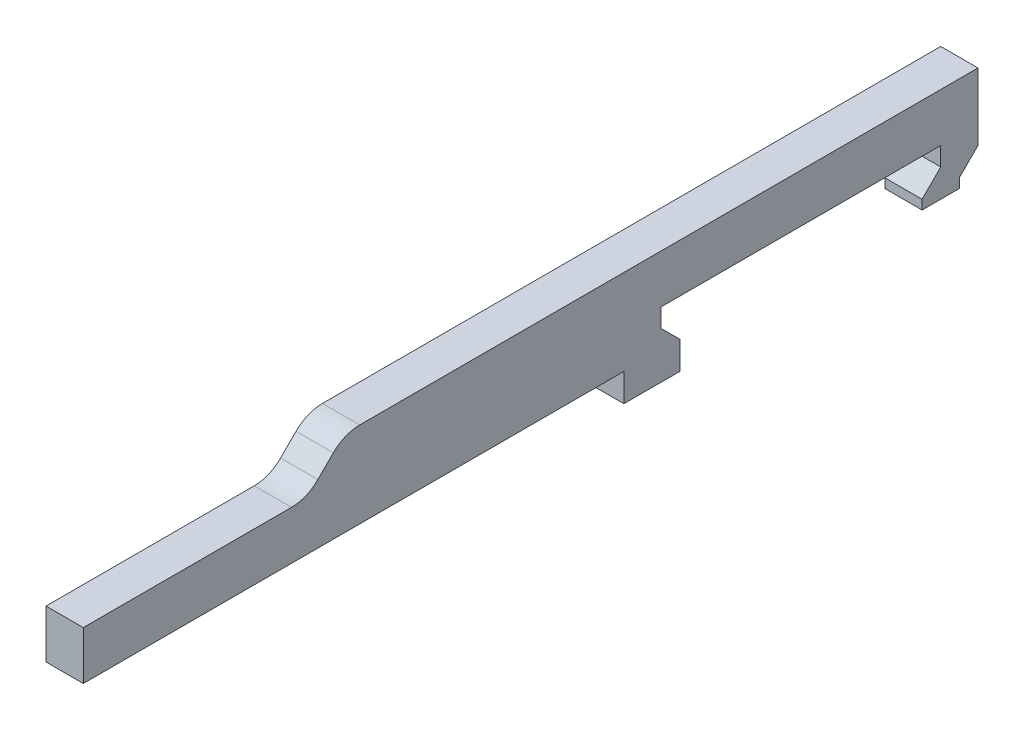
ISO-10303-21;
HEADER;
FILE_DESCRIPTION(('STEP AP214'),'2;1');
FILE_NAME('part.step','',(''),(''),'','','');
FILE_SCHEMA(('AUTOMOTIVE_DESIGN { 1 0 10303 214 1 1 1 1 }'));
ENDSEC;
DATA;
#1=APPLICATION_CONTEXT('core data for automotive mechanical design processes');
#2=APPLICATION_PROTOCOL_DEFINITION('international standard','automotive_design',2000,#1);
#3=PRODUCT_CONTEXT('',#1,'mechanical');
#4=PRODUCT('Part','Part','',(#3));
#5=PRODUCT_RELATED_PRODUCT_CATEGORY('part','',(#4));
#6=PRODUCT_DEFINITION_FORMATION('','',#4);
#7=PRODUCT_DEFINITION_CONTEXT('part definition',#1,'design');
#8=PRODUCT_DEFINITION('design','',#6,#7);
#9=PRODUCT_DEFINITION_SHAPE('','',#8);
#10=(LENGTH_UNIT() NAMED_UNIT(*) SI_UNIT(.MILLI.,.METRE.));
#11=(NAMED_UNIT(*) PLANE_ANGLE_UNIT() SI_UNIT($,.RADIAN.));
#12=(NAMED_UNIT(*) SI_UNIT($,.STERADIAN.) SOLID_ANGLE_UNIT());
#13=UNCERTAINTY_MEASURE_WITH_UNIT(LENGTH_MEASURE(1.E-05),#10,'distance_accuracy_value','');
#14=(GEOMETRIC_REPRESENTATION_CONTEXT(3) GLOBAL_UNCERTAINTY_ASSIGNED_CONTEXT((#13)) GLOBAL_UNIT_ASSIGNED_CONTEXT((#10,
#11,#12)) REPRESENTATION_CONTEXT('',''));
#15=CARTESIAN_POINT('',(0.,0.,0.));
#16=DIRECTION('',(0.,0.,1.));
#17=DIRECTION('',(1.,0.,0.));
#18=AXIS2_PLACEMENT_3D('',#15,#16,#17);
#19=CARTESIAN_POINT('',(2.,0.,-48.));
#20=DIRECTION('',(0.,0.,1.));
#21=DIRECTION('',(1.,0.,0.));
#22=AXIS2_PLACEMENT_3D('',#19,#20,#21);
#23=PLANE('',#22);
#24=DIRECTION('',(0.,1.,0.));
#25=VECTOR('',#24,1.);
#26=CARTESIAN_POINT('',(0.,0.,-48.));
#27=LINE('',#26,#25);
#28=CARTESIAN_POINT('',(0.,0.999999999999994,-48.));
#29=VERTEX_POINT('',#28);
#30=CARTESIAN_POINT('',(0.,4.6,-48.));
#31=VERTEX_POINT('',#30);
#32=EDGE_CURVE('E192',#29,#31,#27,.T.);
#33=ORIENTED_EDGE('',*,*,#32,.T.);
#34=DIRECTION('',(-1.,0.,0.));
#35=VECTOR('',#34,1.);
#36=CARTESIAN_POINT('',(2.,4.6,-48.));
#37=LINE('',#36,#35);
#38=CARTESIAN_POINT('',(2.,4.6,-48.));
#39=VERTEX_POINT('',#38);
#40=EDGE_CURVE('E176',#39,#31,#37,.T.);
#41=ORIENTED_EDGE('',*,*,#40,.F.);
#42=DIRECTION('',(0.,1.,0.));
#43=VECTOR('',#42,1.);
#44=CARTESIAN_POINT('',(2.,0.,-48.));
#45=LINE('',#44,#43);
#46=CARTESIAN_POINT('',(2.,0.999999999999994,-48.));
#47=VERTEX_POINT('',#46);
#48=EDGE_CURVE('E180',#47,#39,#45,.T.);
#49=ORIENTED_EDGE('',*,*,#48,.F.);
#50=DIRECTION('',(-1.,0.,0.));
#51=VECTOR('',#50,1.);
#52=CARTESIAN_POINT('',(2.,0.999999999999994,-48.));
#53=LINE('',#52,#51);
#54=EDGE_CURVE('E266',#47,#29,#53,.T.);
#55=ORIENTED_EDGE('',*,*,#54,.T.);
#56=EDGE_LOOP('',(#33,#41,#49,#55));
#57=FACE_BOUND('',#56,.T.);
#58=ADVANCED_FACE('F36',(#57),#23,.F.);
#59=CARTESIAN_POINT('',(2.,4.59999999999999,0.));
#60=DIRECTION('',(0.,-1.,0.));
#61=DIRECTION('',(0.,0.,-1.));
#62=AXIS2_PLACEMENT_3D('',#59,#60,#61);
#63=PLANE('',#62);
#64=DIRECTION('',(0.,0.,1.));
#65=VECTOR('',#64,1.);
#66=CARTESIAN_POINT('',(0.,4.59999999999999,0.));
#67=LINE('',#66,#65);
#68=CARTESIAN_POINT('',(0.,4.59999999999999,-14.8284271247462));
#69=VERTEX_POINT('',#68);
#70=EDGE_CURVE('E227',#31,#69,#67,.T.);
#71=ORIENTED_EDGE('',*,*,#70,.T.);
#72=DIRECTION('',(-1.,0.,0.));
#73=VECTOR('',#72,1.);
#74=CARTESIAN_POINT('',(2.,4.59999999999999,-14.8284271247462));
#75=LINE('',#74,#73);
#76=CARTESIAN_POINT('',(2.,4.59999999999999,-14.8284271247462));
#77=VERTEX_POINT('',#76);
#78=EDGE_CURVE('E57',#69,#77,#75,.F.);
#79=ORIENTED_EDGE('',*,*,#78,.T.);
#80=DIRECTION('',(0.,0.,1.));
#81=VECTOR('',#80,1.);
#82=CARTESIAN_POINT('',(2.,4.59999999999999,0.));
#83=LINE('',#82,#81);
#84=EDGE_CURVE('E172',#39,#77,#83,.T.);
#85=ORIENTED_EDGE('',*,*,#84,.F.);
#86=ORIENTED_EDGE('',*,*,#40,.T.);
#87=EDGE_LOOP('',(#71,#79,#85,#86));
#88=FACE_BOUND('',#87,.T.);
#89=ADVANCED_FACE('F174',(#88),#63,.F.);
#90=CARTESIAN_POINT('',(2.,-4.7,-4.7));
#91=DIRECTION('',(0.,0.707106781186547,0.707106781186548));
#92=DIRECTION('',(0.,-0.707106781186548,0.707106781186547));
#93=AXIS2_PLACEMENT_3D('',#90,#91,#92);
#94=PLANE('',#93);
#95=DIRECTION('',(0.,0.707106781186548,-0.707106781186547));
#96=VECTOR('',#95,1.);
#97=CARTESIAN_POINT('',(2.,-4.7,-4.7));
#98=LINE('',#97,#96);
#99=CARTESIAN_POINT('',(2.,3.1857864376269,-12.5857864376269));
#100=VERTEX_POINT('',#99);
#101=CARTESIAN_POINT('',(2.,4.01421356237309,-13.4142135623731));
#102=VERTEX_POINT('',#101);
#103=EDGE_CURVE('E179',#100,#102,#98,.T.);
#104=ORIENTED_EDGE('',*,*,#103,.T.);
#105=DIRECTION('',(-1.,0.,0.));
#106=VECTOR('',#105,1.);
#107=CARTESIAN_POINT('',(0.,4.01421356237309,-13.4142135623731));
#108=LINE('',#107,#106);
#109=CARTESIAN_POINT('',(0.,4.01421356237309,-13.4142135623731));
#110=VERTEX_POINT('',#109);
#111=EDGE_CURVE('E196',#102,#110,#108,.T.);
#112=ORIENTED_EDGE('',*,*,#111,.T.);
#113=DIRECTION('',(0.,0.707106781186548,-0.707106781186547));
#114=VECTOR('',#113,1.);
#115=CARTESIAN_POINT('',(0.,-4.7,-4.7));
#116=LINE('',#115,#114);
#117=CARTESIAN_POINT('',(0.,3.1857864376269,-12.5857864376269));
#118=VERTEX_POINT('',#117);
#119=EDGE_CURVE('E216',#118,#110,#116,.T.);
#120=ORIENTED_EDGE('',*,*,#119,.F.);
#121=DIRECTION('',(-1.,0.,0.));
#122=VECTOR('',#121,1.);
#123=CARTESIAN_POINT('',(2.,3.1857864376269,-12.5857864376269));
#124=LINE('',#123,#122);
#125=EDGE_CURVE('E193',#118,#100,#124,.F.);
#126=ORIENTED_EDGE('',*,*,#125,.T.);
#127=EDGE_LOOP('',(#104,#112,#120,#126));
#128=FACE_BOUND('',#127,.T.);
#129=ADVANCED_FACE('F225',(#128),#94,.T.);
#130=CARTESIAN_POINT('',(2.,2.6,0.));
#131=DIRECTION('',(0.,1.,0.));
#132=DIRECTION('',(0.,0.,1.));
#133=AXIS2_PLACEMENT_3D('',#130,#131,#132);
#134=PLANE('',#133);
#135=DIRECTION('',(0.,0.,-1.));
#136=VECTOR('',#135,1.);
#137=CARTESIAN_POINT('',(2.,2.6,0.));
#138=LINE('',#137,#136);
#139=CARTESIAN_POINT('',(2.,2.6,0.));
#140=VERTEX_POINT('',#139);
#141=CARTESIAN_POINT('',(2.,2.6,-11.1715728752538));
#142=VERTEX_POINT('',#141);
#143=EDGE_CURVE('E231',#140,#142,#138,.T.);
#144=ORIENTED_EDGE('',*,*,#143,.T.);
#145=DIRECTION('',(-1.,0.,0.));
#146=VECTOR('',#145,1.);
#147=CARTESIAN_POINT('',(0.,2.6,-11.1715728752538));
#148=LINE('',#147,#146);
#149=CARTESIAN_POINT('',(0.,2.6,-11.1715728752538));
#150=VERTEX_POINT('',#149);
#151=EDGE_CURVE('E209',#142,#150,#148,.T.);
#152=ORIENTED_EDGE('',*,*,#151,.T.);
#153=DIRECTION('',(0.,0.,-1.));
#154=VECTOR('',#153,1.);
#155=CARTESIAN_POINT('',(0.,2.6,0.));
#156=LINE('',#155,#154);
#157=CARTESIAN_POINT('',(0.,2.6,0.));
#158=VERTEX_POINT('',#157);
#159=EDGE_CURVE('E219',#158,#150,#156,.T.);
#160=ORIENTED_EDGE('',*,*,#159,.F.);
#161=DIRECTION('',(-1.,0.,0.));
#162=VECTOR('',#161,1.);
#163=CARTESIAN_POINT('',(2.,2.6,0.));
#164=LINE('',#163,#162);
#165=EDGE_CURVE('E194',#140,#158,#164,.T.);
#166=ORIENTED_EDGE('',*,*,#165,.F.);
#167=EDGE_LOOP('',(#144,#152,#160,#166));
#168=FACE_BOUND('',#167,.T.);
#169=ADVANCED_FACE('F230',(#168),#134,.T.);
#170=CARTESIAN_POINT('',(2.,0.,0.));
#171=DIRECTION('',(0.,0.,1.));
#172=DIRECTION('',(1.,0.,0.));
#173=AXIS2_PLACEMENT_3D('',#170,#171,#172);
#174=PLANE('',#173);
#175=DIRECTION('',(0.,1.,0.));
#176=VECTOR('',#175,1.);
#177=CARTESIAN_POINT('',(0.,0.,0.));
#178=LINE('',#177,#176);
#179=CARTESIAN_POINT('',(0.,0.,0.));
#180=VERTEX_POINT('',#179);
#181=EDGE_CURVE('E270',#180,#158,#178,.T.);
#182=ORIENTED_EDGE('',*,*,#181,.F.);
#183=DIRECTION('',(-1.,0.,0.));
#184=VECTOR('',#183,1.);
#185=CARTESIAN_POINT('',(2.,0.,0.));
#186=LINE('',#185,#184);
#187=CARTESIAN_POINT('',(2.,0.,0.));
#188=VERTEX_POINT('',#187);
#189=EDGE_CURVE('E198',#188,#180,#186,.T.);
#190=ORIENTED_EDGE('',*,*,#189,.F.);
#191=DIRECTION('',(0.,1.,0.));
#192=VECTOR('',#191,1.);
#193=CARTESIAN_POINT('',(2.,0.,0.));
#194=LINE('',#193,#192);
#195=EDGE_CURVE('E234',#188,#140,#194,.T.);
#196=ORIENTED_EDGE('',*,*,#195,.T.);
#197=ORIENTED_EDGE('',*,*,#165,.T.);
#198=EDGE_LOOP('',(#182,#190,#196,#197));
#199=FACE_BOUND('',#198,.T.);
#200=ADVANCED_FACE('F342',(#199),#174,.T.);
#201=CARTESIAN_POINT('',(2.,0.,0.));
#202=DIRECTION('',(0.,1.,0.));
#203=DIRECTION('',(0.,0.,1.));
#204=AXIS2_PLACEMENT_3D('',#201,#202,#203);
#205=PLANE('',#204);
#206=DIRECTION('',(0.,0.,-1.));
#207=VECTOR('',#206,1.);
#208=CARTESIAN_POINT('',(0.,0.,0.));
#209=LINE('',#208,#207);
#210=CARTESIAN_POINT('',(0.,0.,-29.));
#211=VERTEX_POINT('',#210);
#212=EDGE_CURVE('E272',#180,#211,#209,.T.);
#213=ORIENTED_EDGE('',*,*,#212,.T.);
#214=DIRECTION('',(-1.,0.,0.));
#215=VECTOR('',#214,1.);
#216=CARTESIAN_POINT('',(2.,0.,-29.));
#217=LINE('',#216,#215);
#218=CARTESIAN_POINT('',(2.,0.,-29.));
#219=VERTEX_POINT('',#218);
#220=EDGE_CURVE('E331',#219,#211,#217,.T.);
#221=ORIENTED_EDGE('',*,*,#220,.F.);
#222=DIRECTION('',(0.,0.,-1.));
#223=VECTOR('',#222,1.);
#224=CARTESIAN_POINT('',(2.,0.,0.));
#225=LINE('',#224,#223);
#226=EDGE_CURVE('E236',#188,#219,#225,.T.);
#227=ORIENTED_EDGE('',*,*,#226,.F.);
#228=ORIENTED_EDGE('',*,*,#189,.T.);
#229=EDGE_LOOP('',(#213,#221,#227,#228));
#230=FACE_BOUND('',#229,.T.);
#231=ADVANCED_FACE('F336',(#230),#205,.F.);
#232=CARTESIAN_POINT('',(2.,0.,-29.));
#233=DIRECTION('',(0.,0.,-1.));
#234=DIRECTION('',(-1.,0.,0.));
#235=AXIS2_PLACEMENT_3D('',#232,#233,#234);
#236=PLANE('',#235);
#237=DIRECTION('',(0.,-1.,0.));
#238=VECTOR('',#237,1.);
#239=CARTESIAN_POINT('',(0.,0.,-29.));
#240=LINE('',#239,#238);
#241=CARTESIAN_POINT('',(0.,-1.5,-29.));
#242=VERTEX_POINT('',#241);
#243=EDGE_CURVE('E274',#211,#242,#240,.T.);
#244=ORIENTED_EDGE('',*,*,#243,.T.);
#245=DIRECTION('',(-1.,0.,0.));
#246=VECTOR('',#245,1.);
#247=CARTESIAN_POINT('',(2.,-1.5,-29.));
#248=LINE('',#247,#246);
#249=CARTESIAN_POINT('',(2.,-1.5,-29.));
#250=VERTEX_POINT('',#249);
#251=EDGE_CURVE('E328',#250,#242,#248,.T.);
#252=ORIENTED_EDGE('',*,*,#251,.F.);
#253=DIRECTION('',(0.,-1.,0.));
#254=VECTOR('',#253,1.);
#255=CARTESIAN_POINT('',(2.,0.,-29.));
#256=LINE('',#255,#254);
#257=EDGE_CURVE('E241',#219,#250,#256,.T.);
#258=ORIENTED_EDGE('',*,*,#257,.F.);
#259=ORIENTED_EDGE('',*,*,#220,.T.);
#260=EDGE_LOOP('',(#244,#252,#258,#259));
#261=FACE_BOUND('',#260,.T.);
#262=ADVANCED_FACE('F346',(#261),#236,.F.);
#263=CARTESIAN_POINT('',(2.,-1.5,0.));
#264=DIRECTION('',(0.,1.,0.));
#265=DIRECTION('',(0.,0.,1.));
#266=AXIS2_PLACEMENT_3D('',#263,#264,#265);
#267=PLANE('',#266);
#268=DIRECTION('',(0.,0.,-1.));
#269=VECTOR('',#268,1.);
#270=CARTESIAN_POINT('',(0.,-1.5,0.));
#271=LINE('',#270,#269);
#272=CARTESIAN_POINT('',(0.,-1.5,-32.));
#273=VERTEX_POINT('',#272);
#274=EDGE_CURVE('E276',#242,#273,#271,.T.);
#275=ORIENTED_EDGE('',*,*,#274,.T.);
#276=DIRECTION('',(-1.,0.,0.));
#277=VECTOR('',#276,1.);
#278=CARTESIAN_POINT('',(2.,-1.5,-32.));
#279=LINE('',#278,#277);
#280=CARTESIAN_POINT('',(2.,-1.5,-32.));
#281=VERTEX_POINT('',#280);
#282=EDGE_CURVE('E325',#281,#273,#279,.T.);
#283=ORIENTED_EDGE('',*,*,#282,.F.);
#284=DIRECTION('',(0.,0.,-1.));
#285=VECTOR('',#284,1.);
#286=CARTESIAN_POINT('',(2.,-1.5,0.));
#287=LINE('',#286,#285);
#288=EDGE_CURVE('E243',#250,#281,#287,.T.);
#289=ORIENTED_EDGE('',*,*,#288,.F.);
#290=ORIENTED_EDGE('',*,*,#251,.T.);
#291=EDGE_LOOP('',(#275,#283,#289,#290));
#292=FACE_BOUND('',#291,.T.);
#293=ADVANCED_FACE('F350',(#292),#267,.F.);
#294=CARTESIAN_POINT('',(2.,0.,-32.));
#295=DIRECTION('',(0.,0.,1.));
#296=DIRECTION('',(1.,0.,0.));
#297=AXIS2_PLACEMENT_3D('',#294,#295,#296);
#298=PLANE('',#297);
#299=DIRECTION('',(0.,1.,0.));
#300=VECTOR('',#299,1.);
#301=CARTESIAN_POINT('',(0.,0.,-32.));
#302=LINE('',#301,#300);
#303=CARTESIAN_POINT('',(0.,0.,-32.));
#304=VERTEX_POINT('',#303);
#305=EDGE_CURVE('E278',#273,#304,#302,.T.);
#306=ORIENTED_EDGE('',*,*,#305,.T.);
#307=DIRECTION('',(-1.,0.,0.));
#308=VECTOR('',#307,1.);
#309=CARTESIAN_POINT('',(2.,0.,-32.));
#310=LINE('',#309,#308);
#311=CARTESIAN_POINT('',(2.,0.,-32.));
#312=VERTEX_POINT('',#311);
#313=EDGE_CURVE('E322',#312,#304,#310,.T.);
#314=ORIENTED_EDGE('',*,*,#313,.F.);
#315=DIRECTION('',(0.,1.,0.));
#316=VECTOR('',#315,1.);
#317=CARTESIAN_POINT('',(2.,0.,-32.));
#318=LINE('',#317,#316);
#319=EDGE_CURVE('E245',#281,#312,#318,.T.);
#320=ORIENTED_EDGE('',*,*,#319,.F.);
#321=ORIENTED_EDGE('',*,*,#282,.T.);
#322=EDGE_LOOP('',(#306,#314,#320,#321));
#323=FACE_BOUND('',#322,.T.);
#324=ADVANCED_FACE('F356',(#323),#298,.F.);
#325=CARTESIAN_POINT('',(2.,16.,-16.));
#326=DIRECTION('',(0.,-0.707106781186548,0.707106781186547));
#327=DIRECTION('',(0.,-0.707106781186547,-0.707106781186548));
#328=AXIS2_PLACEMENT_3D('',#325,#326,#327);
#329=PLANE('',#328);
#330=DIRECTION('',(0.,0.707106781186547,0.707106781186548));
#331=VECTOR('',#330,1.);
#332=CARTESIAN_POINT('',(0.,16.,-16.));
#333=LINE('',#332,#331);
#334=CARTESIAN_POINT('',(0.,1.,-31.));
#335=VERTEX_POINT('',#334);
#336=EDGE_CURVE('E280',#304,#335,#333,.T.);
#337=ORIENTED_EDGE('',*,*,#336,.T.);
#338=DIRECTION('',(-1.,0.,0.));
#339=VECTOR('',#338,1.);
#340=CARTESIAN_POINT('',(2.,1.,-31.));
#341=LINE('',#340,#339);
#342=CARTESIAN_POINT('',(2.,1.,-31.));
#343=VERTEX_POINT('',#342);
#344=EDGE_CURVE('E319',#343,#335,#341,.T.);
#345=ORIENTED_EDGE('',*,*,#344,.F.);
#346=DIRECTION('',(0.,0.707106781186547,0.707106781186548));
#347=VECTOR('',#346,1.);
#348=CARTESIAN_POINT('',(2.,16.,-16.));
#349=LINE('',#348,#347);
#350=EDGE_CURVE('E247',#312,#343,#349,.T.);
#351=ORIENTED_EDGE('',*,*,#350,.F.);
#352=ORIENTED_EDGE('',*,*,#313,.T.);
#353=EDGE_LOOP('',(#337,#345,#351,#352));
#354=FACE_BOUND('',#353,.T.);
#355=ADVANCED_FACE('F360',(#354),#329,.F.);
#356=CARTESIAN_POINT('',(2.,0.,-31.));
#357=DIRECTION('',(0.,0.,1.));
#358=DIRECTION('',(1.,0.,0.));
#359=AXIS2_PLACEMENT_3D('',#356,#357,#358);
#360=PLANE('',#359);
#361=DIRECTION('',(0.,1.,0.));
#362=VECTOR('',#361,1.);
#363=CARTESIAN_POINT('',(0.,0.,-31.));
#364=LINE('',#363,#362);
#365=CARTESIAN_POINT('',(0.,2.,-31.));
#366=VERTEX_POINT('',#365);
#367=EDGE_CURVE('E282',#335,#366,#364,.T.);
#368=ORIENTED_EDGE('',*,*,#367,.T.);
#369=DIRECTION('',(-1.,0.,0.));
#370=VECTOR('',#369,1.);
#371=CARTESIAN_POINT('',(2.,2.,-31.));
#372=LINE('',#371,#370);
#373=CARTESIAN_POINT('',(2.,2.,-31.));
#374=VERTEX_POINT('',#373);
#375=EDGE_CURVE('E316',#374,#366,#372,.T.);
#376=ORIENTED_EDGE('',*,*,#375,.F.);
#377=DIRECTION('',(0.,1.,0.));
#378=VECTOR('',#377,1.);
#379=CARTESIAN_POINT('',(2.,0.,-31.));
#380=LINE('',#379,#378);
#381=EDGE_CURVE('E249',#343,#374,#380,.T.);
#382=ORIENTED_EDGE('',*,*,#381,.F.);
#383=ORIENTED_EDGE('',*,*,#344,.T.);
#384=EDGE_LOOP('',(#368,#376,#382,#383));
#385=FACE_BOUND('',#384,.T.);
#386=ADVANCED_FACE('F365',(#385),#360,.F.);
#387=CARTESIAN_POINT('',(2.,2.,0.));
#388=DIRECTION('',(0.,1.,0.));
#389=DIRECTION('',(0.,0.,1.));
#390=AXIS2_PLACEMENT_3D('',#387,#388,#389);
#391=PLANE('',#390);
#392=DIRECTION('',(0.,0.,-1.));
#393=VECTOR('',#392,1.);
#394=CARTESIAN_POINT('',(0.,2.,0.));
#395=LINE('',#394,#393);
#396=CARTESIAN_POINT('',(0.,2.,-46.));
#397=VERTEX_POINT('',#396);
#398=EDGE_CURVE('E284',#366,#397,#395,.T.);
#399=ORIENTED_EDGE('',*,*,#398,.T.);
#400=DIRECTION('',(-1.,0.,0.));
#401=VECTOR('',#400,1.);
#402=CARTESIAN_POINT('',(2.,2.,-46.));
#403=LINE('',#402,#401);
#404=CARTESIAN_POINT('',(2.,2.,-46.));
#405=VERTEX_POINT('',#404);
#406=EDGE_CURVE('E314',#405,#397,#403,.T.);
#407=ORIENTED_EDGE('',*,*,#406,.F.);
#408=DIRECTION('',(0.,0.,-1.));
#409=VECTOR('',#408,1.);
#410=CARTESIAN_POINT('',(2.,2.,0.));
#411=LINE('',#410,#409);
#412=EDGE_CURVE('E251',#374,#405,#411,.T.);
#413=ORIENTED_EDGE('',*,*,#412,.F.);
#414=ORIENTED_EDGE('',*,*,#375,.T.);
#415=EDGE_LOOP('',(#399,#407,#413,#414));
#416=FACE_BOUND('',#415,.T.);
#417=ADVANCED_FACE('F371',(#416),#391,.F.);
#418=CARTESIAN_POINT('',(2.,0.,-46.));
#419=DIRECTION('',(0.,0.,1.));
#420=DIRECTION('',(1.,0.,0.));
#421=AXIS2_PLACEMENT_3D('',#418,#419,#420);
#422=PLANE('',#421);
#423=DIRECTION('',(0.,1.,0.));
#424=VECTOR('',#423,1.);
#425=CARTESIAN_POINT('',(0.,0.,-46.));
#426=LINE('',#425,#424);
#427=CARTESIAN_POINT('',(0.,1.,-46.));
#428=VERTEX_POINT('',#427);
#429=EDGE_CURVE('E287',#428,#397,#426,.T.);
#430=ORIENTED_EDGE('',*,*,#429,.F.);
#431=DIRECTION('',(-1.,0.,0.));
#432=VECTOR('',#431,1.);
#433=CARTESIAN_POINT('',(2.,1.,-46.));
#434=LINE('',#433,#432);
#435=CARTESIAN_POINT('',(2.,1.,-46.));
#436=VERTEX_POINT('',#435);
#437=EDGE_CURVE('E312',#436,#428,#434,.T.);
#438=ORIENTED_EDGE('',*,*,#437,.F.);
#439=DIRECTION('',(0.,1.,0.));
#440=VECTOR('',#439,1.);
#441=CARTESIAN_POINT('',(2.,0.,-46.));
#442=LINE('',#441,#440);
#443=EDGE_CURVE('E253',#436,#405,#442,.T.);
#444=ORIENTED_EDGE('',*,*,#443,.T.);
#445=ORIENTED_EDGE('',*,*,#406,.T.);
#446=EDGE_LOOP('',(#430,#438,#444,#445));
#447=FACE_BOUND('',#446,.T.);
#448=ADVANCED_FACE('F375',(#447),#422,.T.);
#449=CARTESIAN_POINT('',(2.,-22.5,-22.5));
#450=DIRECTION('',(0.,0.707106781186548,0.707106781186547));
#451=DIRECTION('',(0.,-0.707106781186547,0.707106781186548));
#452=AXIS2_PLACEMENT_3D('',#449,#450,#451);
#453=PLANE('',#452);
#454=DIRECTION('',(0.,0.707106781186547,-0.707106781186548));
#455=VECTOR('',#454,1.);
#456=CARTESIAN_POINT('',(0.,-22.5,-22.5));
#457=LINE('',#456,#455);
#458=CARTESIAN_POINT('',(0.,0.,-45.));
#459=VERTEX_POINT('',#458);
#460=EDGE_CURVE('E290',#459,#428,#457,.T.);
#461=ORIENTED_EDGE('',*,*,#460,.F.);
#462=DIRECTION('',(-1.,0.,0.));
#463=VECTOR('',#462,1.);
#464=CARTESIAN_POINT('',(2.,0.,-45.));
#465=LINE('',#464,#463);
#466=CARTESIAN_POINT('',(2.,0.,-45.));
#467=VERTEX_POINT('',#466);
#468=EDGE_CURVE('E310',#467,#459,#465,.T.);
#469=ORIENTED_EDGE('',*,*,#468,.F.);
#470=DIRECTION('',(0.,0.707106781186547,-0.707106781186548));
#471=VECTOR('',#470,1.);
#472=CARTESIAN_POINT('',(2.,-22.5,-22.5));
#473=LINE('',#472,#471);
#474=EDGE_CURVE('E256',#467,#436,#473,.T.);
#475=ORIENTED_EDGE('',*,*,#474,.T.);
#476=ORIENTED_EDGE('',*,*,#437,.T.);
#477=EDGE_LOOP('',(#461,#469,#475,#476));
#478=FACE_BOUND('',#477,.T.);
#479=ADVANCED_FACE('F378',(#478),#453,.T.);
#480=CARTESIAN_POINT('',(2.,0.,-45.));
#481=DIRECTION('',(0.,0.,-1.));
#482=DIRECTION('',(-1.,0.,0.));
#483=AXIS2_PLACEMENT_3D('',#480,#481,#482);
#484=PLANE('',#483);
#485=DIRECTION('',(0.,-1.,0.));
#486=VECTOR('',#485,1.);
#487=CARTESIAN_POINT('',(0.,0.,-45.));
#488=LINE('',#487,#486);
#489=CARTESIAN_POINT('',(0.,-0.499999999999998,-45.));
#490=VERTEX_POINT('',#489);
#491=EDGE_CURVE('E293',#459,#490,#488,.T.);
#492=ORIENTED_EDGE('',*,*,#491,.T.);
#493=DIRECTION('',(-1.,0.,0.));
#494=VECTOR('',#493,1.);
#495=CARTESIAN_POINT('',(2.,-0.499999999999998,-45.));
#496=LINE('',#495,#494);
#497=CARTESIAN_POINT('',(2.,-0.499999999999998,-45.));
#498=VERTEX_POINT('',#497);
#499=EDGE_CURVE('E307',#498,#490,#496,.T.);
#500=ORIENTED_EDGE('',*,*,#499,.F.);
#501=DIRECTION('',(0.,-1.,0.));
#502=VECTOR('',#501,1.);
#503=CARTESIAN_POINT('',(2.,0.,-45.));
#504=LINE('',#503,#502);
#505=EDGE_CURVE('E259',#467,#498,#504,.T.);
#506=ORIENTED_EDGE('',*,*,#505,.F.);
#507=ORIENTED_EDGE('',*,*,#468,.T.);
#508=EDGE_LOOP('',(#492,#500,#506,#507));
#509=FACE_BOUND('',#508,.T.);
#510=ADVANCED_FACE('F384',(#509),#484,.F.);
#511=CARTESIAN_POINT('',(2.,-0.499999999999998,0.));
#512=DIRECTION('',(0.,1.,0.));
#513=DIRECTION('',(0.,0.,1.));
#514=AXIS2_PLACEMENT_3D('',#511,#512,#513);
#515=PLANE('',#514);
#516=DIRECTION('',(0.,0.,-1.));
#517=VECTOR('',#516,1.);
#518=CARTESIAN_POINT('',(0.,-0.499999999999998,0.));
#519=LINE('',#518,#517);
#520=CARTESIAN_POINT('',(0.,-0.499999999999998,-47.));
#521=VERTEX_POINT('',#520);
#522=EDGE_CURVE('E295',#490,#521,#519,.T.);
#523=ORIENTED_EDGE('',*,*,#522,.T.);
#524=DIRECTION('',(-1.,0.,0.));
#525=VECTOR('',#524,1.);
#526=CARTESIAN_POINT('',(2.,-0.499999999999998,-47.));
#527=LINE('',#526,#525);
#528=CARTESIAN_POINT('',(2.,-0.499999999999998,-47.));
#529=VERTEX_POINT('',#528);
#530=EDGE_CURVE('E304',#529,#521,#527,.T.);
#531=ORIENTED_EDGE('',*,*,#530,.F.);
#532=DIRECTION('',(0.,0.,-1.));
#533=VECTOR('',#532,1.);
#534=CARTESIAN_POINT('',(2.,-0.499999999999998,0.));
#535=LINE('',#534,#533);
#536=EDGE_CURVE('E261',#498,#529,#535,.T.);
#537=ORIENTED_EDGE('',*,*,#536,.F.);
#538=ORIENTED_EDGE('',*,*,#499,.T.);
#539=EDGE_LOOP('',(#523,#531,#537,#538));
#540=FACE_BOUND('',#539,.T.);
#541=ADVANCED_FACE('F388',(#540),#515,.F.);
#542=CARTESIAN_POINT('',(2.,0.,-47.));
#543=DIRECTION('',(0.,0.,1.));
#544=DIRECTION('',(1.,0.,0.));
#545=AXIS2_PLACEMENT_3D('',#542,#543,#544);
#546=PLANE('',#545);
#547=DIRECTION('',(0.,1.,0.));
#548=VECTOR('',#547,1.);
#549=CARTESIAN_POINT('',(0.,0.,-47.));
#550=LINE('',#549,#548);
#551=CARTESIAN_POINT('',(0.,0.,-47.));
#552=VERTEX_POINT('',#551);
#553=EDGE_CURVE('E297',#521,#552,#550,.T.);
#554=ORIENTED_EDGE('',*,*,#553,.T.);
#555=DIRECTION('',(-1.,0.,0.));
#556=VECTOR('',#555,1.);
#557=CARTESIAN_POINT('',(2.,0.,-47.));
#558=LINE('',#557,#556);
#559=CARTESIAN_POINT('',(2.,0.,-47.));
#560=VERTEX_POINT('',#559);
#561=EDGE_CURVE('E301',#560,#552,#558,.T.);
#562=ORIENTED_EDGE('',*,*,#561,.F.);
#563=DIRECTION('',(0.,1.,0.));
#564=VECTOR('',#563,1.);
#565=CARTESIAN_POINT('',(2.,0.,-47.));
#566=LINE('',#565,#564);
#567=EDGE_CURVE('E263',#529,#560,#566,.T.);
#568=ORIENTED_EDGE('',*,*,#567,.F.);
#569=ORIENTED_EDGE('',*,*,#530,.T.);
#570=EDGE_LOOP('',(#554,#562,#568,#569));
#571=FACE_BOUND('',#570,.T.);
#572=ADVANCED_FACE('F393',(#571),#546,.F.);
#573=CARTESIAN_POINT('',(2.,-23.5,-23.5));
#574=DIRECTION('',(0.,0.707106781186548,0.707106781186547));
#575=DIRECTION('',(0.,-0.707106781186547,0.707106781186548));
#576=AXIS2_PLACEMENT_3D('',#573,#574,#575);
#577=PLANE('',#576);
#578=DIRECTION('',(0.,0.707106781186547,-0.707106781186548));
#579=VECTOR('',#578,1.);
#580=CARTESIAN_POINT('',(0.,-23.5,-23.5));
#581=LINE('',#580,#579);
#582=EDGE_CURVE('E189',#552,#29,#581,.T.);
#583=ORIENTED_EDGE('',*,*,#582,.T.);
#584=ORIENTED_EDGE('',*,*,#54,.F.);
#585=DIRECTION('',(0.,0.707106781186547,-0.707106781186548));
#586=VECTOR('',#585,1.);
#587=CARTESIAN_POINT('',(2.,-23.5,-23.5));
#588=LINE('',#587,#586);
#589=EDGE_CURVE('E185',#560,#47,#588,.T.);
#590=ORIENTED_EDGE('',*,*,#589,.F.);
#591=ORIENTED_EDGE('',*,*,#561,.T.);
#592=EDGE_LOOP('',(#583,#584,#590,#591));
#593=FACE_BOUND('',#592,.T.);
#594=ADVANCED_FACE('F396',(#593),#577,.F.);
#595=CARTESIAN_POINT('',(2.,0.,0.));
#596=DIRECTION('',(1.,0.,0.));
#597=DIRECTION('',(0.,0.,-1.));
#598=AXIS2_PLACEMENT_3D('',#595,#596,#597);
#599=PLANE('',#598);
#600=ORIENTED_EDGE('',*,*,#84,.T.);
#601=CARTESIAN_POINT('',(2.,2.59999999999999,-14.8284271247462));
#602=DIRECTION('',(1.,0.,0.));
#603=DIRECTION('',(0.,0.,-1.));
#604=AXIS2_PLACEMENT_3D('',#601,#602,#603);
#605=CIRCLE('',#604,2.);
#606=EDGE_CURVE('E207',#77,#102,#605,.T.);
#607=ORIENTED_EDGE('',*,*,#606,.T.);
#608=ORIENTED_EDGE('',*,*,#103,.F.);
#609=CARTESIAN_POINT('',(2.,4.6,-11.1715728752538));
#610=DIRECTION('',(1.,0.,0.));
#611=DIRECTION('',(0.,0.,-1.));
#612=AXIS2_PLACEMENT_3D('',#609,#610,#611);
#613=CIRCLE('',#612,2.);
#614=EDGE_CURVE('E11',#100,#142,#613,.F.);
#615=ORIENTED_EDGE('',*,*,#614,.T.);
#616=ORIENTED_EDGE('',*,*,#143,.F.);
#617=ORIENTED_EDGE('',*,*,#195,.F.);
#618=ORIENTED_EDGE('',*,*,#226,.T.);
#619=ORIENTED_EDGE('',*,*,#257,.T.);
#620=ORIENTED_EDGE('',*,*,#288,.T.);
#621=ORIENTED_EDGE('',*,*,#319,.T.);
#622=ORIENTED_EDGE('',*,*,#350,.T.);
#623=ORIENTED_EDGE('',*,*,#381,.T.);
#624=ORIENTED_EDGE('',*,*,#412,.T.);
#625=ORIENTED_EDGE('',*,*,#443,.F.);
#626=ORIENTED_EDGE('',*,*,#474,.F.);
#627=ORIENTED_EDGE('',*,*,#505,.T.);
#628=ORIENTED_EDGE('',*,*,#536,.T.);
#629=ORIENTED_EDGE('',*,*,#567,.T.);
#630=ORIENTED_EDGE('',*,*,#589,.T.);
#631=ORIENTED_EDGE('',*,*,#48,.T.);
#632=EDGE_LOOP('',(#600,#607,#608,#615,#616,#617,#618,#619,#620,#621,#622,#623,#624,#625,#626,
#627,#628,#629,#630,#631));
#633=FACE_BOUND('',#632,.T.);
#634=ADVANCED_FACE('F183',(#633),#599,.T.);
#635=CARTESIAN_POINT('',(0.,0.,0.));
#636=DIRECTION('',(1.,0.,0.));
#637=DIRECTION('',(0.,0.,-1.));
#638=AXIS2_PLACEMENT_3D('',#635,#636,#637);
#639=PLANE('',#638);
#640=ORIENTED_EDGE('',*,*,#119,.T.);
#641=CARTESIAN_POINT('',(0.,2.59999999999999,-14.8284271247462));
#642=DIRECTION('',(1.,0.,0.));
#643=DIRECTION('',(0.,0.,-1.));
#644=AXIS2_PLACEMENT_3D('',#641,#642,#643);
#645=CIRCLE('',#644,2.);
#646=EDGE_CURVE('E204',#110,#69,#645,.F.);
#647=ORIENTED_EDGE('',*,*,#646,.T.);
#648=ORIENTED_EDGE('',*,*,#70,.F.);
#649=ORIENTED_EDGE('',*,*,#32,.F.);
#650=ORIENTED_EDGE('',*,*,#582,.F.);
#651=ORIENTED_EDGE('',*,*,#553,.F.);
#652=ORIENTED_EDGE('',*,*,#522,.F.);
#653=ORIENTED_EDGE('',*,*,#491,.F.);
#654=ORIENTED_EDGE('',*,*,#460,.T.);
#655=ORIENTED_EDGE('',*,*,#429,.T.);
#656=ORIENTED_EDGE('',*,*,#398,.F.);
#657=ORIENTED_EDGE('',*,*,#367,.F.);
#658=ORIENTED_EDGE('',*,*,#336,.F.);
#659=ORIENTED_EDGE('',*,*,#305,.F.);
#660=ORIENTED_EDGE('',*,*,#274,.F.);
#661=ORIENTED_EDGE('',*,*,#243,.F.);
#662=ORIENTED_EDGE('',*,*,#212,.F.);
#663=ORIENTED_EDGE('',*,*,#181,.T.);
#664=ORIENTED_EDGE('',*,*,#159,.T.);
#665=CARTESIAN_POINT('',(0.,4.6,-11.1715728752538));
#666=DIRECTION('',(1.,0.,0.));
#667=DIRECTION('',(0.,0.,-1.));
#668=AXIS2_PLACEMENT_3D('',#665,#666,#667);
#669=CIRCLE('',#668,2.);
#670=EDGE_CURVE('E44',#150,#118,#669,.T.);
#671=ORIENTED_EDGE('',*,*,#670,.T.);
#672=EDGE_LOOP('',(#640,#647,#648,#649,#650,#651,#652,#653,#654,#655,#656,#657,#658,#659,#660,
#661,#662,#663,#664,#671));
#673=FACE_BOUND('',#672,.T.);
#674=ADVANCED_FACE('F215',(#673),#639,.F.);
#675=CARTESIAN_POINT('',(2.,2.59999999999999,-14.8284271247462));
#676=DIRECTION('',(1.,0.,0.));
#677=DIRECTION('',(0.,0.,-1.));
#678=AXIS2_PLACEMENT_3D('',#675,#676,#677);
#679=CYLINDRICAL_SURFACE('',#678,2.);
#680=ORIENTED_EDGE('',*,*,#606,.F.);
#681=ORIENTED_EDGE('',*,*,#78,.F.);
#682=ORIENTED_EDGE('',*,*,#646,.F.);
#683=ORIENTED_EDGE('',*,*,#111,.F.);
#684=EDGE_LOOP('',(#680,#681,#682,#683));
#685=FACE_BOUND('',#684,.T.);
#686=ADVANCED_FACE('F398',(#685),#679,.T.);
#687=CARTESIAN_POINT('',(2.,4.6,-11.1715728752538));
#688=DIRECTION('',(1.,0.,0.));
#689=DIRECTION('',(0.,0.,-1.));
#690=AXIS2_PLACEMENT_3D('',#687,#688,#689);
#691=CYLINDRICAL_SURFACE('',#690,2.);
#692=ORIENTED_EDGE('',*,*,#614,.F.);
#693=ORIENTED_EDGE('',*,*,#125,.F.);
#694=ORIENTED_EDGE('',*,*,#670,.F.);
#695=ORIENTED_EDGE('',*,*,#151,.F.);
#696=EDGE_LOOP('',(#692,#693,#694,#695));
#697=FACE_BOUND('',#696,.T.);
#698=ADVANCED_FACE('F38',(#697),#691,.F.);
#699=CLOSED_SHELL('',(#58,#89,#129,#169,#200,#231,#262,#293,#324,#355,#386,#417,#448,#479,#510,
#541,#572,#594,#634,#674,#686,#698));
#700=MANIFOLD_SOLID_BREP('B2',#699);
#701=ADVANCED_BREP_SHAPE_REPRESENTATION('',(#18,#700),#14);
#702=SHAPE_DEFINITION_REPRESENTATION(#9,#701);
ENDSEC;
END-ISO-10303-21;
